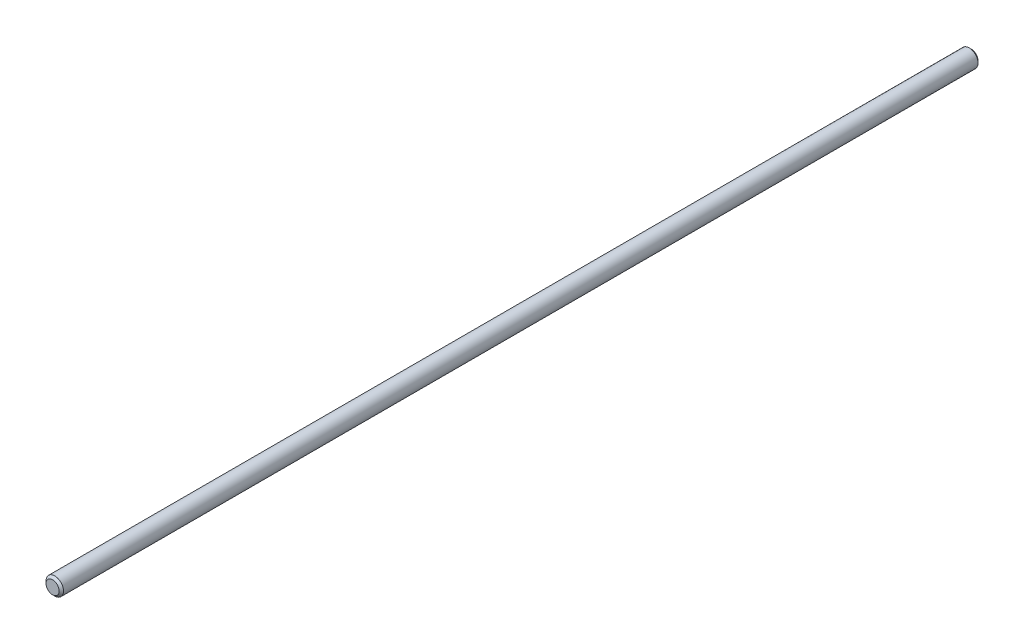
ISO-10303-21;
HEADER;
FILE_DESCRIPTION(('STEP AP214'),'2;1');
FILE_NAME('part.step','',(''),(''),'','','');
FILE_SCHEMA(('AUTOMOTIVE_DESIGN { 1 0 10303 214 1 1 1 1 }'));
ENDSEC;
DATA;
#1=APPLICATION_CONTEXT('core data for automotive mechanical design processes');
#2=APPLICATION_PROTOCOL_DEFINITION('international standard','automotive_design',2000,#1);
#3=PRODUCT_CONTEXT('',#1,'mechanical');
#4=PRODUCT('Part','Part','',(#3));
#5=PRODUCT_RELATED_PRODUCT_CATEGORY('part','',(#4));
#6=PRODUCT_DEFINITION_FORMATION('','',#4);
#7=PRODUCT_DEFINITION_CONTEXT('part definition',#1,'design');
#8=PRODUCT_DEFINITION('design','',#6,#7);
#9=PRODUCT_DEFINITION_SHAPE('','',#8);
#10=(LENGTH_UNIT() NAMED_UNIT(*) SI_UNIT(.MILLI.,.METRE.));
#11=(NAMED_UNIT(*) PLANE_ANGLE_UNIT() SI_UNIT($,.RADIAN.));
#12=(NAMED_UNIT(*) SI_UNIT($,.STERADIAN.) SOLID_ANGLE_UNIT());
#13=UNCERTAINTY_MEASURE_WITH_UNIT(LENGTH_MEASURE(1.E-05),#10,'distance_accuracy_value','');
#14=(GEOMETRIC_REPRESENTATION_CONTEXT(3) GLOBAL_UNCERTAINTY_ASSIGNED_CONTEXT((#13)) GLOBAL_UNIT_ASSIGNED_CONTEXT((#10,
#11,#12)) REPRESENTATION_CONTEXT('',''));
#15=CARTESIAN_POINT('',(0.,0.,0.));
#16=DIRECTION('',(0.,0.,1.));
#17=DIRECTION('',(1.,0.,0.));
#18=AXIS2_PLACEMENT_3D('',#15,#16,#17);
#19=CARTESIAN_POINT('',(0.,0.,420.));
#20=DIRECTION('',(0.,0.,-1.));
#21=DIRECTION('',(-1.,0.,0.));
#22=AXIS2_PLACEMENT_3D('',#19,#20,#21);
#23=CYLINDRICAL_SURFACE('',#22,4.);
#24=CARTESIAN_POINT('',(0.,0.,419.));
#25=DIRECTION('',(0.,0.,1.));
#26=DIRECTION('',(1.,0.,0.));
#27=AXIS2_PLACEMENT_3D('',#24,#25,#26);
#28=CIRCLE('',#27,4.);
#29=CARTESIAN_POINT('',(4.,0.,419.));
#30=VERTEX_POINT('',#29);
#31=EDGE_CURVE('E41',#30,#30,#28,.F.);
#32=ORIENTED_EDGE('',*,*,#31,.T.);
#33=EDGE_LOOP('',(#32));
#34=FACE_BOUND('',#33,.T.);
#35=CARTESIAN_POINT('',(0.,0.,0.999999999999945));
#36=DIRECTION('',(0.,0.,1.));
#37=DIRECTION('',(1.,0.,0.));
#38=AXIS2_PLACEMENT_3D('',#35,#36,#37);
#39=CIRCLE('',#38,4.);
#40=CARTESIAN_POINT('',(4.,0.,0.999999999999945));
#41=VERTEX_POINT('',#40);
#42=EDGE_CURVE('E45',#41,#41,#39,.T.);
#43=ORIENTED_EDGE('',*,*,#42,.T.);
#44=EDGE_LOOP('',(#43));
#45=FACE_BOUND('',#44,.T.);
#46=ADVANCED_FACE('F34',(#34,#45),#23,.T.);
#47=CARTESIAN_POINT('',(0.,0.,420.));
#48=DIRECTION('',(0.,0.,1.));
#49=DIRECTION('',(1.,0.,0.));
#50=AXIS2_PLACEMENT_3D('',#47,#48,#49);
#51=PLANE('',#50);
#52=CARTESIAN_POINT('',(0.,0.,420.));
#53=DIRECTION('',(0.,0.,1.));
#54=DIRECTION('',(1.,0.,0.));
#55=AXIS2_PLACEMENT_3D('',#52,#53,#54);
#56=CIRCLE('',#55,2.99999999999995);
#57=CARTESIAN_POINT('',(2.99999999999995,0.,420.));
#58=VERTEX_POINT('',#57);
#59=EDGE_CURVE('E49',#58,#58,#56,.T.);
#60=ORIENTED_EDGE('',*,*,#59,.T.);
#61=EDGE_LOOP('',(#60));
#62=FACE_BOUND('',#61,.T.);
#63=ADVANCED_FACE('F55',(#62),#51,.T.);
#64=CARTESIAN_POINT('',(0.,0.,0.));
#65=DIRECTION('',(0.,0.,1.));
#66=DIRECTION('',(1.,0.,0.));
#67=AXIS2_PLACEMENT_3D('',#64,#65,#66);
#68=PLANE('',#67);
#69=CARTESIAN_POINT('',(0.,0.,0.));
#70=DIRECTION('',(0.,0.,1.));
#71=DIRECTION('',(1.,0.,0.));
#72=AXIS2_PLACEMENT_3D('',#69,#70,#71);
#73=CIRCLE('',#72,3.00000000000011);
#74=CARTESIAN_POINT('',(3.00000000000011,0.,0.));
#75=VERTEX_POINT('',#74);
#76=EDGE_CURVE('E10',#75,#75,#73,.F.);
#77=ORIENTED_EDGE('',*,*,#76,.T.);
#78=EDGE_LOOP('',(#77));
#79=FACE_BOUND('',#78,.T.);
#80=ADVANCED_FACE('F59',(#79),#68,.F.);
#81=CARTESIAN_POINT('',(0.,0.,420.));
#82=DIRECTION('',(0.,0.,-1.));
#83=DIRECTION('',(-1.,0.,0.));
#84=AXIS2_PLACEMENT_3D('',#81,#82,#83);
#85=CONICAL_SURFACE('',#84,2.99999999999995,0.785398163397474);
#86=ORIENTED_EDGE('',*,*,#31,.F.);
#87=EDGE_LOOP('',(#86));
#88=FACE_BOUND('',#87,.T.);
#89=ORIENTED_EDGE('',*,*,#59,.F.);
#90=EDGE_LOOP('',(#89));
#91=FACE_BOUND('',#90,.T.);
#92=ADVANCED_FACE('F57',(#88,#91),#85,.T.);
#93=CARTESIAN_POINT('',(0.,0.,0.999999999999945));
#94=DIRECTION('',(0.,0.,1.));
#95=DIRECTION('',(1.,0.,0.));
#96=AXIS2_PLACEMENT_3D('',#93,#94,#95);
#97=CONICAL_SURFACE('',#96,4.,0.785398163397419);
#98=ORIENTED_EDGE('',*,*,#76,.F.);
#99=EDGE_LOOP('',(#98));
#100=FACE_BOUND('',#99,.T.);
#101=ORIENTED_EDGE('',*,*,#42,.F.);
#102=EDGE_LOOP('',(#101));
#103=FACE_BOUND('',#102,.T.);
#104=ADVANCED_FACE('F36',(#100,#103),#97,.T.);
#105=CLOSED_SHELL('',(#46,#63,#80,#92,#104));
#106=MANIFOLD_SOLID_BREP('B2',#105);
#107=ADVANCED_BREP_SHAPE_REPRESENTATION('',(#18,#106),#14);
#108=SHAPE_DEFINITION_REPRESENTATION(#9,#107);
ENDSEC;
END-ISO-10303-21;
